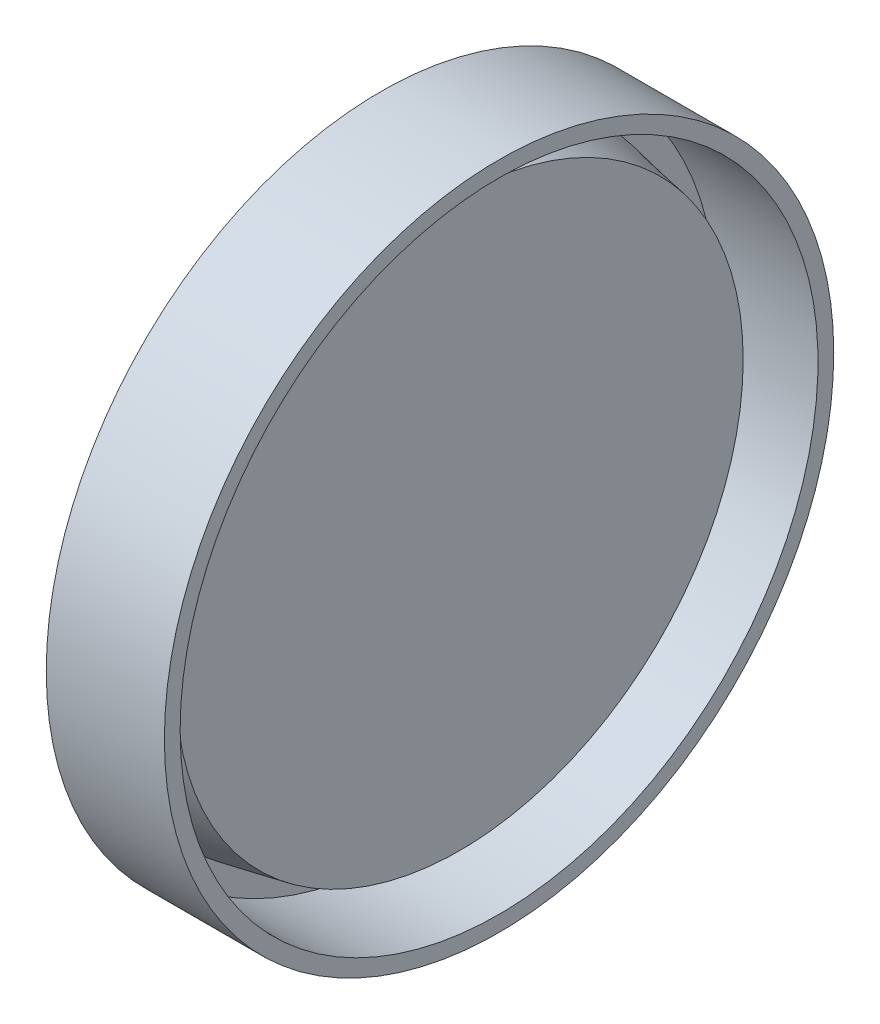
ISO-10303-21;
HEADER;
FILE_DESCRIPTION(('STEP AP214'),'2;1');
FILE_NAME('part.step','',(''),(''),'','','');
FILE_SCHEMA(('AUTOMOTIVE_DESIGN { 1 0 10303 214 1 1 1 1 }'));
ENDSEC;
DATA;
#1=APPLICATION_CONTEXT('core data for automotive mechanical design processes');
#2=APPLICATION_PROTOCOL_DEFINITION('international standard','automotive_design',2000,#1);
#3=PRODUCT_CONTEXT('',#1,'mechanical');
#4=PRODUCT('Part','Part','',(#3));
#5=PRODUCT_RELATED_PRODUCT_CATEGORY('part','',(#4));
#6=PRODUCT_DEFINITION_FORMATION('','',#4);
#7=PRODUCT_DEFINITION_CONTEXT('part definition',#1,'design');
#8=PRODUCT_DEFINITION('design','',#6,#7);
#9=PRODUCT_DEFINITION_SHAPE('','',#8);
#10=(LENGTH_UNIT() NAMED_UNIT(*) SI_UNIT(.MILLI.,.METRE.));
#11=(NAMED_UNIT(*) PLANE_ANGLE_UNIT() SI_UNIT($,.RADIAN.));
#12=(NAMED_UNIT(*) SI_UNIT($,.STERADIAN.) SOLID_ANGLE_UNIT());
#13=UNCERTAINTY_MEASURE_WITH_UNIT(LENGTH_MEASURE(1.E-05),#10,'distance_accuracy_value','');
#14=(GEOMETRIC_REPRESENTATION_CONTEXT(3) GLOBAL_UNCERTAINTY_ASSIGNED_CONTEXT((#13)) GLOBAL_UNIT_ASSIGNED_CONTEXT((#10,
#11,#12)) REPRESENTATION_CONTEXT('',''));
#15=CARTESIAN_POINT('',(0.,0.,0.));
#16=DIRECTION('',(0.,0.,1.));
#17=DIRECTION('',(1.,0.,0.));
#18=AXIS2_PLACEMENT_3D('',#15,#16,#17);
#19=CARTESIAN_POINT('',(0.,0.,0.));
#20=DIRECTION('',(1.,0.,0.));
#21=DIRECTION('',(0.,0.,-1.));
#22=AXIS2_PLACEMENT_3D('',#19,#20,#21);
#23=PLANE('',#22);
#24=CARTESIAN_POINT('',(0.,0.,0.));
#25=DIRECTION('',(-1.,0.,0.));
#26=DIRECTION('',(0.,0.,1.));
#27=AXIS2_PLACEMENT_3D('',#24,#25,#26);
#28=CIRCLE('',#27,34.3401474254875);
#29=CARTESIAN_POINT('',(0.,0.,34.3401474254875));
#30=VERTEX_POINT('',#29);
#31=EDGE_CURVE('E10',#30,#30,#28,.T.);
#32=ORIENTED_EDGE('',*,*,#31,.T.);
#33=EDGE_LOOP('',(#32));
#34=FACE_BOUND('',#33,.T.);
#35=ADVANCED_FACE('F35',(#34),#23,.F.);
#36=CARTESIAN_POINT('',(-8.,0.,0.));
#37=DIRECTION('',(-1.,0.,0.));
#38=DIRECTION('',(0.,0.,1.));
#39=AXIS2_PLACEMENT_3D('',#36,#37,#38);
#40=CONICAL_SURFACE('',#39,35.8401474254875,0.185347949995694);
#41=ORIENTED_EDGE('',*,*,#31,.F.);
#42=EDGE_LOOP('',(#41));
#43=FACE_BOUND('',#42,.T.);
#44=CARTESIAN_POINT('',(-8.,0.,0.));
#45=DIRECTION('',(-1.,0.,0.));
#46=DIRECTION('',(0.,0.,1.));
#47=AXIS2_PLACEMENT_3D('',#44,#45,#46);
#48=CIRCLE('',#47,35.8401474254875);
#49=CARTESIAN_POINT('',(-8.,0.,35.8401474254875));
#50=VERTEX_POINT('',#49);
#51=EDGE_CURVE('E41',#50,#50,#48,.T.);
#52=ORIENTED_EDGE('',*,*,#51,.T.);
#53=EDGE_LOOP('',(#52));
#54=FACE_BOUND('',#53,.T.);
#55=ADVANCED_FACE('F79',(#43,#54),#40,.F.);
#56=CARTESIAN_POINT('',(-8.,35.8401474254875,0.));
#57=DIRECTION('',(1.,0.,0.));
#58=DIRECTION('',(0.,0.,-1.));
#59=AXIS2_PLACEMENT_3D('',#56,#57,#58);
#60=PLANE('',#59);
#61=ORIENTED_EDGE('',*,*,#51,.F.);
#62=EDGE_LOOP('',(#61));
#63=FACE_BOUND('',#62,.T.);
#64=CARTESIAN_POINT('',(-8.,0.,0.));
#65=DIRECTION('',(-1.,0.,0.));
#66=DIRECTION('',(0.,0.,1.));
#67=AXIS2_PLACEMENT_3D('',#64,#65,#66);
#68=CIRCLE('',#67,42.5);
#69=CARTESIAN_POINT('',(-8.,0.,42.5));
#70=VERTEX_POINT('',#69);
#71=EDGE_CURVE('E45',#70,#70,#68,.T.);
#72=ORIENTED_EDGE('',*,*,#71,.T.);
#73=EDGE_LOOP('',(#72));
#74=FACE_BOUND('',#73,.T.);
#75=ADVANCED_FACE('F83',(#63,#74),#60,.F.);
#76=CARTESIAN_POINT('',(0.,0.,0.));
#77=DIRECTION('',(-1.,0.,0.));
#78=DIRECTION('',(0.,0.,1.));
#79=AXIS2_PLACEMENT_3D('',#76,#77,#78);
#80=CYLINDRICAL_SURFACE('',#79,42.5);
#81=ORIENTED_EDGE('',*,*,#71,.F.);
#82=EDGE_LOOP('',(#81));
#83=FACE_BOUND('',#82,.T.);
#84=CARTESIAN_POINT('',(7.,0.,0.));
#85=DIRECTION('',(-1.,0.,0.));
#86=DIRECTION('',(0.,0.,1.));
#87=AXIS2_PLACEMENT_3D('',#84,#85,#86);
#88=CIRCLE('',#87,42.5);
#89=CARTESIAN_POINT('',(7.,0.,42.5));
#90=VERTEX_POINT('',#89);
#91=EDGE_CURVE('E49',#90,#90,#88,.T.);
#92=ORIENTED_EDGE('',*,*,#91,.T.);
#93=EDGE_LOOP('',(#92));
#94=FACE_BOUND('',#93,.T.);
#95=ADVANCED_FACE('F88',(#83,#94),#80,.T.);
#96=CARTESIAN_POINT('',(7.,42.5,0.));
#97=DIRECTION('',(-1.,0.,0.));
#98=DIRECTION('',(0.,0.,1.));
#99=AXIS2_PLACEMENT_3D('',#96,#97,#98);
#100=PLANE('',#99);
#101=ORIENTED_EDGE('',*,*,#91,.F.);
#102=EDGE_LOOP('',(#101));
#103=FACE_BOUND('',#102,.T.);
#104=CARTESIAN_POINT('',(7.,0.,0.));
#105=DIRECTION('',(-1.,0.,0.));
#106=DIRECTION('',(0.,0.,1.));
#107=AXIS2_PLACEMENT_3D('',#104,#105,#106);
#108=CIRCLE('',#107,40.5);
#109=CARTESIAN_POINT('',(7.,0.,40.5));
#110=VERTEX_POINT('',#109);
#111=EDGE_CURVE('E54',#110,#110,#108,.T.);
#112=ORIENTED_EDGE('',*,*,#111,.T.);
#113=EDGE_LOOP('',(#112));
#114=FACE_BOUND('',#113,.T.);
#115=ADVANCED_FACE('F94',(#103,#114),#100,.F.);
#116=CARTESIAN_POINT('',(0.,0.,0.));
#117=DIRECTION('',(-1.,0.,0.));
#118=DIRECTION('',(0.,0.,1.));
#119=AXIS2_PLACEMENT_3D('',#116,#117,#118);
#120=CYLINDRICAL_SURFACE('',#119,40.5);
#121=ORIENTED_EDGE('',*,*,#111,.F.);
#122=EDGE_LOOP('',(#121));
#123=FACE_BOUND('',#122,.T.);
#124=CARTESIAN_POINT('',(-6.,0.,0.));
#125=DIRECTION('',(-1.,0.,0.));
#126=DIRECTION('',(0.,0.,1.));
#127=AXIS2_PLACEMENT_3D('',#124,#125,#126);
#128=CIRCLE('',#127,40.5);
#129=CARTESIAN_POINT('',(-6.,0.,40.5));
#130=VERTEX_POINT('',#129);
#131=EDGE_CURVE('E57',#130,#130,#128,.T.);
#132=ORIENTED_EDGE('',*,*,#131,.T.);
#133=EDGE_LOOP('',(#132));
#134=FACE_BOUND('',#133,.T.);
#135=ADVANCED_FACE('F98',(#123,#134),#120,.F.);
#136=CARTESIAN_POINT('',(-6.,40.5,0.));
#137=DIRECTION('',(-1.,0.,0.));
#138=DIRECTION('',(0.,0.,1.));
#139=AXIS2_PLACEMENT_3D('',#136,#137,#138);
#140=PLANE('',#139);
#141=ORIENTED_EDGE('',*,*,#131,.F.);
#142=EDGE_LOOP('',(#141));
#143=FACE_BOUND('',#142,.T.);
#144=CARTESIAN_POINT('',(-6.,0.,0.));
#145=DIRECTION('',(-1.,0.,0.));
#146=DIRECTION('',(0.,0.,1.));
#147=AXIS2_PLACEMENT_3D('',#144,#145,#146);
#148=CIRCLE('',#147,37.5);
#149=CARTESIAN_POINT('',(-6.,0.,37.5));
#150=VERTEX_POINT('',#149);
#151=EDGE_CURVE('E60',#150,#150,#148,.T.);
#152=ORIENTED_EDGE('',*,*,#151,.T.);
#153=EDGE_LOOP('',(#152));
#154=FACE_BOUND('',#153,.T.);
#155=ADVANCED_FACE('F75',(#143,#154),#140,.F.);
#156=CARTESIAN_POINT('',(2.,0.,0.));
#157=DIRECTION('',(-1.,0.,0.));
#158=DIRECTION('',(0.,0.,1.));
#159=AXIS2_PLACEMENT_3D('',#156,#157,#158);
#160=CONICAL_SURFACE('',#159,36.,0.185347949995694);
#161=ORIENTED_EDGE('',*,*,#151,.F.);
#162=EDGE_LOOP('',(#161));
#163=FACE_BOUND('',#162,.T.);
#164=CARTESIAN_POINT('',(2.,0.,0.));
#165=DIRECTION('',(-1.,0.,0.));
#166=DIRECTION('',(0.,0.,1.));
#167=AXIS2_PLACEMENT_3D('',#164,#165,#166);
#168=CIRCLE('',#167,36.);
#169=CARTESIAN_POINT('',(2.,0.,36.));
#170=VERTEX_POINT('',#169);
#171=EDGE_CURVE('E63',#170,#170,#168,.T.);
#172=ORIENTED_EDGE('',*,*,#171,.T.);
#173=EDGE_LOOP('',(#172));
#174=FACE_BOUND('',#173,.T.);
#175=ADVANCED_FACE('F67',(#163,#174),#160,.T.);
#176=CARTESIAN_POINT('',(2.,36.,0.));
#177=DIRECTION('',(-1.,0.,0.));
#178=DIRECTION('',(0.,0.,1.));
#179=AXIS2_PLACEMENT_3D('',#176,#177,#178);
#180=PLANE('',#179);
#181=ORIENTED_EDGE('',*,*,#171,.F.);
#182=EDGE_LOOP('',(#181));
#183=FACE_BOUND('',#182,.T.);
#184=ADVANCED_FACE('F69',(#183),#180,.F.);
#185=CLOSED_SHELL('',(#35,#55,#75,#95,#115,#135,#155,#175,#184));
#186=MANIFOLD_SOLID_BREP('B2',#185);
#187=ADVANCED_BREP_SHAPE_REPRESENTATION('',(#18,#186),#14);
#188=SHAPE_DEFINITION_REPRESENTATION(#9,#187);
ENDSEC;
END-ISO-10303-21;
